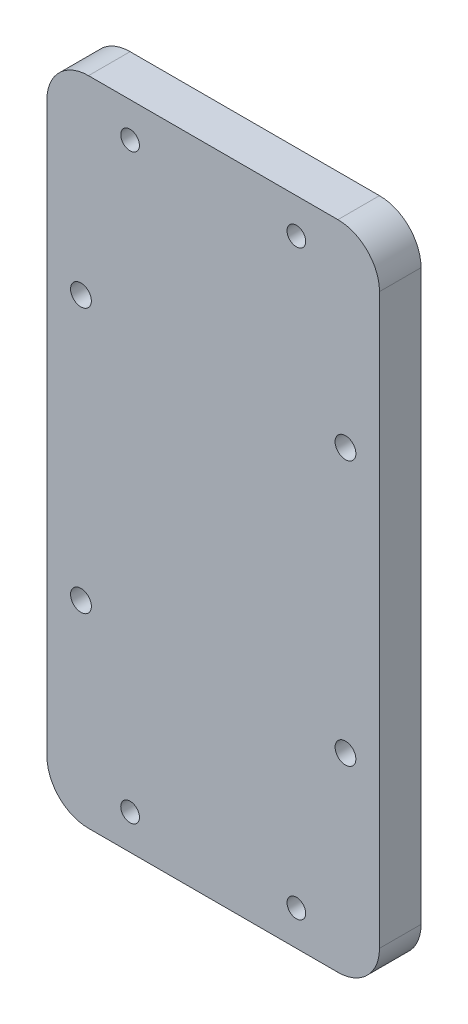
ISO-10303-21;
HEADER;
FILE_DESCRIPTION(('STEP AP214'),'2;1');
FILE_NAME('part.step','',(''),(''),'','','');
FILE_SCHEMA(('AUTOMOTIVE_DESIGN { 1 0 10303 214 1 1 1 1 }'));
ENDSEC;
DATA;
#1=APPLICATION_CONTEXT('core data for automotive mechanical design processes');
#2=APPLICATION_PROTOCOL_DEFINITION('international standard','automotive_design',2000,#1);
#3=PRODUCT_CONTEXT('',#1,'mechanical');
#4=PRODUCT('Part','Part','',(#3));
#5=PRODUCT_RELATED_PRODUCT_CATEGORY('part','',(#4));
#6=PRODUCT_DEFINITION_FORMATION('','',#4);
#7=PRODUCT_DEFINITION_CONTEXT('part definition',#1,'design');
#8=PRODUCT_DEFINITION('design','',#6,#7);
#9=PRODUCT_DEFINITION_SHAPE('','',#8);
#10=(LENGTH_UNIT() NAMED_UNIT(*) SI_UNIT(.MILLI.,.METRE.));
#11=(NAMED_UNIT(*) PLANE_ANGLE_UNIT() SI_UNIT($,.RADIAN.));
#12=(NAMED_UNIT(*) SI_UNIT($,.STERADIAN.) SOLID_ANGLE_UNIT());
#13=UNCERTAINTY_MEASURE_WITH_UNIT(LENGTH_MEASURE(1.E-05),#10,'distance_accuracy_value','');
#14=(GEOMETRIC_REPRESENTATION_CONTEXT(3) GLOBAL_UNCERTAINTY_ASSIGNED_CONTEXT((#13)) GLOBAL_UNIT_ASSIGNED_CONTEXT((#10,
#11,#12)) REPRESENTATION_CONTEXT('',''));
#15=CARTESIAN_POINT('',(0.,0.,0.));
#16=DIRECTION('',(0.,0.,1.));
#17=DIRECTION('',(1.,0.,0.));
#18=AXIS2_PLACEMENT_3D('',#15,#16,#17);
#19=CARTESIAN_POINT('',(30.,68.4127881051919,10.));
#20=DIRECTION('',(0.,0.,1.));
#21=DIRECTION('',(1.,0.,0.));
#22=AXIS2_PLACEMENT_3D('',#19,#20,#21);
#23=PLANE('',#22);
#24=CARTESIAN_POINT('',(31.8198051533946,31.8198051533947,10.));
#25=DIRECTION('',(0.,0.,1.));
#26=DIRECTION('',(1.,0.,0.));
#27=AXIS2_PLACEMENT_3D('',#24,#25,#26);
#28=CIRCLE('',#27,2.49999999999999);
#29=CARTESIAN_POINT('',(34.3198051533946,31.8198051533947,10.));
#30=VERTEX_POINT('',#29);
#31=EDGE_CURVE('E231',#30,#30,#28,.T.);
#32=ORIENTED_EDGE('',*,*,#31,.F.);
#33=EDGE_LOOP('',(#32));
#34=FACE_BOUND('',#33,.T.);
#35=CARTESIAN_POINT('',(-31.8198051533948,31.8198051533945,10.));
#36=DIRECTION('',(0.,0.,1.));
#37=DIRECTION('',(1.,0.,0.));
#38=AXIS2_PLACEMENT_3D('',#35,#36,#37);
#39=CIRCLE('',#38,2.49999999999999);
#40=CARTESIAN_POINT('',(-29.3198051533948,31.8198051533945,10.));
#41=VERTEX_POINT('',#40);
#42=EDGE_CURVE('E226',#41,#41,#39,.T.);
#43=ORIENTED_EDGE('',*,*,#42,.F.);
#44=EDGE_LOOP('',(#43));
#45=FACE_BOUND('',#44,.T.);
#46=CARTESIAN_POINT('',(31.8198051533948,-31.8198051533945,10.));
#47=DIRECTION('',(0.,0.,1.));
#48=DIRECTION('',(1.,0.,0.));
#49=AXIS2_PLACEMENT_3D('',#46,#47,#48);
#50=CIRCLE('',#49,2.49999999999999);
#51=CARTESIAN_POINT('',(34.3198051533948,-31.8198051533945,10.));
#52=VERTEX_POINT('',#51);
#53=EDGE_CURVE('E222',#52,#52,#50,.T.);
#54=ORIENTED_EDGE('',*,*,#53,.F.);
#55=EDGE_LOOP('',(#54));
#56=FACE_BOUND('',#55,.T.);
#57=CARTESIAN_POINT('',(-31.8198051533944,-31.8198051533949,10.));
#58=DIRECTION('',(0.,0.,1.));
#59=DIRECTION('',(1.,0.,0.));
#60=AXIS2_PLACEMENT_3D('',#57,#58,#59);
#61=CIRCLE('',#60,2.49999999999999);
#62=CARTESIAN_POINT('',(-29.3198051533944,-31.8198051533949,10.));
#63=VERTEX_POINT('',#62);
#64=EDGE_CURVE('E214',#63,#63,#61,.T.);
#65=ORIENTED_EDGE('',*,*,#64,.F.);
#66=EDGE_LOOP('',(#65));
#67=FACE_BOUND('',#66,.T.);
#68=CARTESIAN_POINT('',(20.,-70.,10.));
#69=DIRECTION('',(0.,0.,1.));
#70=DIRECTION('',(1.,0.,0.));
#71=AXIS2_PLACEMENT_3D('',#68,#69,#70);
#72=CIRCLE('',#71,2.25);
#73=CARTESIAN_POINT('',(22.25,-70.,10.));
#74=VERTEX_POINT('',#73);
#75=EDGE_CURVE('E196',#74,#74,#72,.T.);
#76=ORIENTED_EDGE('',*,*,#75,.F.);
#77=EDGE_LOOP('',(#76));
#78=FACE_BOUND('',#77,.T.);
#79=CARTESIAN_POINT('',(-20.,70.,10.));
#80=DIRECTION('',(0.,0.,1.));
#81=DIRECTION('',(1.,0.,0.));
#82=AXIS2_PLACEMENT_3D('',#79,#80,#81);
#83=CIRCLE('',#82,2.25);
#84=CARTESIAN_POINT('',(-17.75,70.,10.));
#85=VERTEX_POINT('',#84);
#86=EDGE_CURVE('E145',#85,#85,#83,.T.);
#87=ORIENTED_EDGE('',*,*,#86,.F.);
#88=EDGE_LOOP('',(#87));
#89=FACE_BOUND('',#88,.T.);
#90=CARTESIAN_POINT('',(30.,68.4127881051919,10.));
#91=DIRECTION('',(0.,0.,1.));
#92=DIRECTION('',(1.,0.,0.));
#93=AXIS2_PLACEMENT_3D('',#90,#91,#92);
#94=CIRCLE('',#93,9.99999999999999);
#95=CARTESIAN_POINT('',(40.,68.4127881051919,10.));
#96=VERTEX_POINT('',#95);
#97=CARTESIAN_POINT('',(30.,78.4127881051919,10.));
#98=VERTEX_POINT('',#97);
#99=EDGE_CURVE('E154',#96,#98,#94,.T.);
#100=ORIENTED_EDGE('',*,*,#99,.T.);
#101=DIRECTION('',(-1.,0.,0.));
#102=VECTOR('',#101,1.);
#103=CARTESIAN_POINT('',(-30.,78.4127881051919,10.));
#104=LINE('',#103,#102);
#105=CARTESIAN_POINT('',(-30.,78.4127881051919,10.));
#106=VERTEX_POINT('',#105);
#107=EDGE_CURVE('E103',#98,#106,#104,.T.);
#108=ORIENTED_EDGE('',*,*,#107,.T.);
#109=CARTESIAN_POINT('',(-30.,68.4127881051919,10.));
#110=DIRECTION('',(0.,0.,1.));
#111=DIRECTION('',(1.,0.,0.));
#112=AXIS2_PLACEMENT_3D('',#109,#110,#111);
#113=CIRCLE('',#112,9.99999999999999);
#114=CARTESIAN_POINT('',(-40.,68.4127881051919,10.));
#115=VERTEX_POINT('',#114);
#116=EDGE_CURVE('E168',#106,#115,#113,.T.);
#117=ORIENTED_EDGE('',*,*,#116,.T.);
#118=DIRECTION('',(0.,-1.,0.));
#119=VECTOR('',#118,1.);
#120=CARTESIAN_POINT('',(-40.,68.4127881051919,10.));
#121=LINE('',#120,#119);
#122=CARTESIAN_POINT('',(-40.,-68.4127881051919,10.));
#123=VERTEX_POINT('',#122);
#124=EDGE_CURVE('E181',#115,#123,#121,.T.);
#125=ORIENTED_EDGE('',*,*,#124,.T.);
#126=CARTESIAN_POINT('',(-30.,-68.4127881051919,10.));
#127=DIRECTION('',(0.,0.,1.));
#128=DIRECTION('',(-1.,0.,0.));
#129=AXIS2_PLACEMENT_3D('',#126,#127,#128);
#130=CIRCLE('',#129,10.);
#131=CARTESIAN_POINT('',(-30.,-78.4127881051919,10.));
#132=VERTEX_POINT('',#131);
#133=EDGE_CURVE('E125',#123,#132,#130,.T.);
#134=ORIENTED_EDGE('',*,*,#133,.T.);
#135=DIRECTION('',(1.,0.,0.));
#136=VECTOR('',#135,1.);
#137=CARTESIAN_POINT('',(-30.,-78.4127881051919,10.));
#138=LINE('',#137,#136);
#139=CARTESIAN_POINT('',(30.,-78.4127881051919,10.));
#140=VERTEX_POINT('',#139);
#141=EDGE_CURVE('E119',#132,#140,#138,.T.);
#142=ORIENTED_EDGE('',*,*,#141,.T.);
#143=CARTESIAN_POINT('',(30.,-68.4127881051919,10.));
#144=DIRECTION('',(0.,0.,1.));
#145=DIRECTION('',(1.,0.,0.));
#146=AXIS2_PLACEMENT_3D('',#143,#144,#145);
#147=CIRCLE('',#146,9.99999999999999);
#148=CARTESIAN_POINT('',(40.,-68.4127881051919,10.));
#149=VERTEX_POINT('',#148);
#150=EDGE_CURVE('E117',#140,#149,#147,.T.);
#151=ORIENTED_EDGE('',*,*,#150,.T.);
#152=DIRECTION('',(0.,1.,0.));
#153=VECTOR('',#152,1.);
#154=CARTESIAN_POINT('',(40.,68.4127881051919,10.));
#155=LINE('',#154,#153);
#156=EDGE_CURVE('E58',#149,#96,#155,.T.);
#157=ORIENTED_EDGE('',*,*,#156,.T.);
#158=EDGE_LOOP('',(#100,#108,#117,#125,#134,#142,#151,#157));
#159=FACE_BOUND('',#158,.T.);
#160=CARTESIAN_POINT('',(20.,70.,10.));
#161=DIRECTION('',(0.,0.,1.));
#162=DIRECTION('',(-1.,0.,0.));
#163=AXIS2_PLACEMENT_3D('',#160,#161,#162);
#164=CIRCLE('',#163,2.25);
#165=CARTESIAN_POINT('',(17.75,70.,10.));
#166=VERTEX_POINT('',#165);
#167=EDGE_CURVE('E195',#166,#166,#164,.T.);
#168=ORIENTED_EDGE('',*,*,#167,.F.);
#169=EDGE_LOOP('',(#168));
#170=FACE_BOUND('',#169,.T.);
#171=CARTESIAN_POINT('',(-20.,-70.,10.));
#172=DIRECTION('',(0.,0.,1.));
#173=DIRECTION('',(-1.,0.,0.));
#174=AXIS2_PLACEMENT_3D('',#171,#172,#173);
#175=CIRCLE('',#174,2.25);
#176=CARTESIAN_POINT('',(-22.25,-70.,10.));
#177=VERTEX_POINT('',#176);
#178=EDGE_CURVE('E204',#177,#177,#175,.T.);
#179=ORIENTED_EDGE('',*,*,#178,.F.);
#180=EDGE_LOOP('',(#179));
#181=FACE_BOUND('',#180,.T.);
#182=ADVANCED_FACE('F43',(#34,#45,#56,#67,#78,#89,#159,#170,#181),#23,.T.);
#183=CARTESIAN_POINT('',(30.,68.4127881051919,0.));
#184=DIRECTION('',(0.,0.,1.));
#185=DIRECTION('',(1.,0.,0.));
#186=AXIS2_PLACEMENT_3D('',#183,#184,#185);
#187=PLANE('',#186);
#188=CARTESIAN_POINT('',(31.8198051533946,31.8198051533947,0.));
#189=DIRECTION('',(0.,0.,1.));
#190=DIRECTION('',(1.,0.,0.));
#191=AXIS2_PLACEMENT_3D('',#188,#189,#190);
#192=CIRCLE('',#191,2.5);
#193=CARTESIAN_POINT('',(34.3198051533946,31.8198051533947,0.));
#194=VERTEX_POINT('',#193);
#195=EDGE_CURVE('E227',#194,#194,#192,.T.);
#196=ORIENTED_EDGE('',*,*,#195,.T.);
#197=EDGE_LOOP('',(#196));
#198=FACE_BOUND('',#197,.T.);
#199=CARTESIAN_POINT('',(-31.8198051533948,31.8198051533945,0.));
#200=DIRECTION('',(0.,0.,1.));
#201=DIRECTION('',(1.,0.,0.));
#202=AXIS2_PLACEMENT_3D('',#199,#200,#201);
#203=CIRCLE('',#202,2.5);
#204=CARTESIAN_POINT('',(-29.3198051533948,31.8198051533945,0.));
#205=VERTEX_POINT('',#204);
#206=EDGE_CURVE('E221',#205,#205,#203,.T.);
#207=ORIENTED_EDGE('',*,*,#206,.T.);
#208=EDGE_LOOP('',(#207));
#209=FACE_BOUND('',#208,.T.);
#210=CARTESIAN_POINT('',(31.8198051533948,-31.8198051533945,0.));
#211=DIRECTION('',(0.,0.,1.));
#212=DIRECTION('',(1.,0.,0.));
#213=AXIS2_PLACEMENT_3D('',#210,#211,#212);
#214=CIRCLE('',#213,2.5);
#215=CARTESIAN_POINT('',(34.3198051533948,-31.8198051533945,0.));
#216=VERTEX_POINT('',#215);
#217=EDGE_CURVE('E217',#216,#216,#214,.T.);
#218=ORIENTED_EDGE('',*,*,#217,.T.);
#219=EDGE_LOOP('',(#218));
#220=FACE_BOUND('',#219,.T.);
#221=CARTESIAN_POINT('',(-31.8198051533944,-31.8198051533949,0.));
#222=DIRECTION('',(0.,0.,1.));
#223=DIRECTION('',(1.,0.,0.));
#224=AXIS2_PLACEMENT_3D('',#221,#222,#223);
#225=CIRCLE('',#224,2.5);
#226=CARTESIAN_POINT('',(-29.3198051533944,-31.8198051533949,0.));
#227=VERTEX_POINT('',#226);
#228=EDGE_CURVE('E209',#227,#227,#225,.T.);
#229=ORIENTED_EDGE('',*,*,#228,.T.);
#230=EDGE_LOOP('',(#229));
#231=FACE_BOUND('',#230,.T.);
#232=CARTESIAN_POINT('',(30.,68.4127881051919,0.));
#233=DIRECTION('',(0.,0.,1.));
#234=DIRECTION('',(1.,0.,0.));
#235=AXIS2_PLACEMENT_3D('',#232,#233,#234);
#236=CIRCLE('',#235,9.99999999999999);
#237=CARTESIAN_POINT('',(40.,68.4127881051919,0.));
#238=VERTEX_POINT('',#237);
#239=CARTESIAN_POINT('',(30.,78.4127881051919,0.));
#240=VERTEX_POINT('',#239);
#241=EDGE_CURVE('E139',#238,#240,#236,.T.);
#242=ORIENTED_EDGE('',*,*,#241,.F.);
#243=DIRECTION('',(0.,1.,0.));
#244=VECTOR('',#243,1.);
#245=CARTESIAN_POINT('',(40.,68.4127881051919,0.));
#246=LINE('',#245,#244);
#247=CARTESIAN_POINT('',(40.,-68.4127881051919,0.));
#248=VERTEX_POINT('',#247);
#249=EDGE_CURVE('E92',#248,#238,#246,.T.);
#250=ORIENTED_EDGE('',*,*,#249,.F.);
#251=CARTESIAN_POINT('',(30.,-68.4127881051919,0.));
#252=DIRECTION('',(0.,0.,1.));
#253=DIRECTION('',(1.,0.,0.));
#254=AXIS2_PLACEMENT_3D('',#251,#252,#253);
#255=CIRCLE('',#254,9.99999999999999);
#256=CARTESIAN_POINT('',(30.,-78.4127881051919,0.));
#257=VERTEX_POINT('',#256);
#258=EDGE_CURVE('E90',#257,#248,#255,.T.);
#259=ORIENTED_EDGE('',*,*,#258,.F.);
#260=DIRECTION('',(1.,0.,0.));
#261=VECTOR('',#260,1.);
#262=CARTESIAN_POINT('',(-30.,-78.4127881051919,0.));
#263=LINE('',#262,#261);
#264=CARTESIAN_POINT('',(-30.,-78.4127881051919,0.));
#265=VERTEX_POINT('',#264);
#266=EDGE_CURVE('E128',#265,#257,#263,.T.);
#267=ORIENTED_EDGE('',*,*,#266,.F.);
#268=CARTESIAN_POINT('',(-30.,-68.4127881051919,0.));
#269=DIRECTION('',(0.,0.,1.));
#270=DIRECTION('',(-1.,0.,0.));
#271=AXIS2_PLACEMENT_3D('',#268,#269,#270);
#272=CIRCLE('',#271,10.);
#273=CARTESIAN_POINT('',(-40.,-68.4127881051919,0.));
#274=VERTEX_POINT('',#273);
#275=EDGE_CURVE('E147',#274,#265,#272,.T.);
#276=ORIENTED_EDGE('',*,*,#275,.F.);
#277=DIRECTION('',(0.,-1.,0.));
#278=VECTOR('',#277,1.);
#279=CARTESIAN_POINT('',(-40.,68.4127881051919,0.));
#280=LINE('',#279,#278);
#281=CARTESIAN_POINT('',(-40.,68.4127881051919,0.));
#282=VERTEX_POINT('',#281);
#283=EDGE_CURVE('E146',#282,#274,#280,.T.);
#284=ORIENTED_EDGE('',*,*,#283,.F.);
#285=CARTESIAN_POINT('',(-30.,68.4127881051919,0.));
#286=DIRECTION('',(0.,0.,1.));
#287=DIRECTION('',(1.,0.,0.));
#288=AXIS2_PLACEMENT_3D('',#285,#286,#287);
#289=CIRCLE('',#288,9.99999999999999);
#290=CARTESIAN_POINT('',(-30.,78.4127881051919,0.));
#291=VERTEX_POINT('',#290);
#292=EDGE_CURVE('E148',#291,#282,#289,.T.);
#293=ORIENTED_EDGE('',*,*,#292,.F.);
#294=DIRECTION('',(-1.,0.,0.));
#295=VECTOR('',#294,1.);
#296=CARTESIAN_POINT('',(-30.,78.4127881051919,0.));
#297=LINE('',#296,#295);
#298=EDGE_CURVE('E141',#240,#291,#297,.T.);
#299=ORIENTED_EDGE('',*,*,#298,.F.);
#300=EDGE_LOOP('',(#242,#250,#259,#267,#276,#284,#293,#299));
#301=FACE_BOUND('',#300,.T.);
#302=CARTESIAN_POINT('',(-20.,70.,0.));
#303=DIRECTION('',(0.,0.,1.));
#304=DIRECTION('',(1.,0.,0.));
#305=AXIS2_PLACEMENT_3D('',#302,#303,#304);
#306=CIRCLE('',#305,2.25);
#307=CARTESIAN_POINT('',(-17.75,70.,0.));
#308=VERTEX_POINT('',#307);
#309=EDGE_CURVE('E188',#308,#308,#306,.T.);
#310=ORIENTED_EDGE('',*,*,#309,.T.);
#311=EDGE_LOOP('',(#310));
#312=FACE_BOUND('',#311,.T.);
#313=CARTESIAN_POINT('',(20.,70.,0.));
#314=DIRECTION('',(0.,0.,1.));
#315=DIRECTION('',(-1.,0.,0.));
#316=AXIS2_PLACEMENT_3D('',#313,#314,#315);
#317=CIRCLE('',#316,2.25);
#318=CARTESIAN_POINT('',(17.75,70.,0.));
#319=VERTEX_POINT('',#318);
#320=EDGE_CURVE('E194',#319,#319,#317,.T.);
#321=ORIENTED_EDGE('',*,*,#320,.T.);
#322=EDGE_LOOP('',(#321));
#323=FACE_BOUND('',#322,.T.);
#324=CARTESIAN_POINT('',(20.,-70.,0.));
#325=DIRECTION('',(0.,0.,1.));
#326=DIRECTION('',(1.,0.,0.));
#327=AXIS2_PLACEMENT_3D('',#324,#325,#326);
#328=CIRCLE('',#327,2.25);
#329=CARTESIAN_POINT('',(22.25,-70.,0.));
#330=VERTEX_POINT('',#329);
#331=EDGE_CURVE('E203',#330,#330,#328,.T.);
#332=ORIENTED_EDGE('',*,*,#331,.T.);
#333=EDGE_LOOP('',(#332));
#334=FACE_BOUND('',#333,.T.);
#335=CARTESIAN_POINT('',(-20.,-70.,0.));
#336=DIRECTION('',(0.,0.,1.));
#337=DIRECTION('',(-1.,0.,0.));
#338=AXIS2_PLACEMENT_3D('',#335,#336,#337);
#339=CIRCLE('',#338,2.25);
#340=CARTESIAN_POINT('',(-22.25,-70.,0.));
#341=VERTEX_POINT('',#340);
#342=EDGE_CURVE('E210',#341,#341,#339,.T.);
#343=ORIENTED_EDGE('',*,*,#342,.T.);
#344=EDGE_LOOP('',(#343));
#345=FACE_BOUND('',#344,.T.);
#346=ADVANCED_FACE('F173',(#198,#209,#220,#231,#301,#312,#323,#334,#345),#187,.F.);
#347=CARTESIAN_POINT('',(30.,68.4127881051919,10.));
#348=DIRECTION('',(0.,0.,-1.));
#349=DIRECTION('',(-1.,0.,0.));
#350=AXIS2_PLACEMENT_3D('',#347,#348,#349);
#351=CYLINDRICAL_SURFACE('',#350,9.99999999999999);
#352=ORIENTED_EDGE('',*,*,#241,.T.);
#353=DIRECTION('',(0.,0.,-1.));
#354=VECTOR('',#353,1.);
#355=CARTESIAN_POINT('',(30.,78.4127881051919,10.));
#356=LINE('',#355,#354);
#357=EDGE_CURVE('E11',#98,#240,#356,.T.);
#358=ORIENTED_EDGE('',*,*,#357,.F.);
#359=ORIENTED_EDGE('',*,*,#99,.F.);
#360=DIRECTION('',(0.,0.,-1.));
#361=VECTOR('',#360,1.);
#362=CARTESIAN_POINT('',(40.,68.4127881051919,10.));
#363=LINE('',#362,#361);
#364=EDGE_CURVE('E138',#96,#238,#363,.T.);
#365=ORIENTED_EDGE('',*,*,#364,.T.);
#366=EDGE_LOOP('',(#352,#358,#359,#365));
#367=FACE_BOUND('',#366,.T.);
#368=ADVANCED_FACE('F44',(#367),#351,.T.);
#369=CARTESIAN_POINT('',(-30.,78.4127881051919,10.));
#370=DIRECTION('',(0.,-1.,0.));
#371=DIRECTION('',(0.,0.,-1.));
#372=AXIS2_PLACEMENT_3D('',#369,#370,#371);
#373=PLANE('',#372);
#374=ORIENTED_EDGE('',*,*,#298,.T.);
#375=DIRECTION('',(0.,0.,-1.));
#376=VECTOR('',#375,1.);
#377=CARTESIAN_POINT('',(-30.,78.4127881051919,10.));
#378=LINE('',#377,#376);
#379=EDGE_CURVE('E55',#106,#291,#378,.T.);
#380=ORIENTED_EDGE('',*,*,#379,.F.);
#381=ORIENTED_EDGE('',*,*,#107,.F.);
#382=ORIENTED_EDGE('',*,*,#357,.T.);
#383=EDGE_LOOP('',(#374,#380,#381,#382));
#384=FACE_BOUND('',#383,.T.);
#385=ADVANCED_FACE('F303',(#384),#373,.F.);
#386=CARTESIAN_POINT('',(-30.,68.4127881051919,10.));
#387=DIRECTION('',(0.,0.,-1.));
#388=DIRECTION('',(-1.,0.,0.));
#389=AXIS2_PLACEMENT_3D('',#386,#387,#388);
#390=CYLINDRICAL_SURFACE('',#389,9.99999999999999);
#391=ORIENTED_EDGE('',*,*,#292,.T.);
#392=DIRECTION('',(0.,0.,-1.));
#393=VECTOR('',#392,1.);
#394=CARTESIAN_POINT('',(-40.,68.4127881051919,10.));
#395=LINE('',#394,#393);
#396=EDGE_CURVE('E165',#115,#282,#395,.T.);
#397=ORIENTED_EDGE('',*,*,#396,.F.);
#398=ORIENTED_EDGE('',*,*,#116,.F.);
#399=ORIENTED_EDGE('',*,*,#379,.T.);
#400=EDGE_LOOP('',(#391,#397,#398,#399));
#401=FACE_BOUND('',#400,.T.);
#402=ADVANCED_FACE('F169',(#401),#390,.T.);
#403=CARTESIAN_POINT('',(-40.,68.4127881051919,10.));
#404=DIRECTION('',(1.,0.,0.));
#405=DIRECTION('',(0.,1.,0.));
#406=AXIS2_PLACEMENT_3D('',#403,#404,#405);
#407=PLANE('',#406);
#408=ORIENTED_EDGE('',*,*,#283,.T.);
#409=DIRECTION('',(0.,0.,-1.));
#410=VECTOR('',#409,1.);
#411=CARTESIAN_POINT('',(-40.,-68.4127881051919,10.));
#412=LINE('',#411,#410);
#413=EDGE_CURVE('E157',#123,#274,#412,.T.);
#414=ORIENTED_EDGE('',*,*,#413,.F.);
#415=ORIENTED_EDGE('',*,*,#124,.F.);
#416=ORIENTED_EDGE('',*,*,#396,.T.);
#417=EDGE_LOOP('',(#408,#414,#415,#416));
#418=FACE_BOUND('',#417,.T.);
#419=ADVANCED_FACE('F177',(#418),#407,.F.);
#420=CARTESIAN_POINT('',(-30.,-68.4127881051919,10.));
#421=DIRECTION('',(0.,0.,-1.));
#422=DIRECTION('',(-1.,0.,0.));
#423=AXIS2_PLACEMENT_3D('',#420,#421,#422);
#424=CYLINDRICAL_SURFACE('',#423,10.);
#425=ORIENTED_EDGE('',*,*,#275,.T.);
#426=DIRECTION('',(0.,0.,-1.));
#427=VECTOR('',#426,1.);
#428=CARTESIAN_POINT('',(-30.,-78.4127881051919,10.));
#429=LINE('',#428,#427);
#430=EDGE_CURVE('E134',#132,#265,#429,.T.);
#431=ORIENTED_EDGE('',*,*,#430,.F.);
#432=ORIENTED_EDGE('',*,*,#133,.F.);
#433=ORIENTED_EDGE('',*,*,#413,.T.);
#434=EDGE_LOOP('',(#425,#431,#432,#433));
#435=FACE_BOUND('',#434,.T.);
#436=ADVANCED_FACE('F185',(#435),#424,.T.);
#437=CARTESIAN_POINT('',(-30.,-78.4127881051919,10.));
#438=DIRECTION('',(0.,1.,0.));
#439=DIRECTION('',(-1.,0.,0.));
#440=AXIS2_PLACEMENT_3D('',#437,#438,#439);
#441=PLANE('',#440);
#442=ORIENTED_EDGE('',*,*,#266,.T.);
#443=DIRECTION('',(0.,0.,-1.));
#444=VECTOR('',#443,1.);
#445=CARTESIAN_POINT('',(30.,-78.4127881051919,10.));
#446=LINE('',#445,#444);
#447=EDGE_CURVE('E130',#140,#257,#446,.T.);
#448=ORIENTED_EDGE('',*,*,#447,.F.);
#449=ORIENTED_EDGE('',*,*,#141,.F.);
#450=ORIENTED_EDGE('',*,*,#430,.T.);
#451=EDGE_LOOP('',(#442,#448,#449,#450));
#452=FACE_BOUND('',#451,.T.);
#453=ADVANCED_FACE('F126',(#452),#441,.F.);
#454=CARTESIAN_POINT('',(30.,-68.4127881051919,10.));
#455=DIRECTION('',(0.,0.,-1.));
#456=DIRECTION('',(-1.,0.,0.));
#457=AXIS2_PLACEMENT_3D('',#454,#455,#456);
#458=CYLINDRICAL_SURFACE('',#457,9.99999999999999);
#459=ORIENTED_EDGE('',*,*,#258,.T.);
#460=DIRECTION('',(0.,0.,-1.));
#461=VECTOR('',#460,1.);
#462=CARTESIAN_POINT('',(40.,-68.4127881051919,10.));
#463=LINE('',#462,#461);
#464=EDGE_CURVE('E131',#149,#248,#463,.T.);
#465=ORIENTED_EDGE('',*,*,#464,.F.);
#466=ORIENTED_EDGE('',*,*,#150,.F.);
#467=ORIENTED_EDGE('',*,*,#447,.T.);
#468=EDGE_LOOP('',(#459,#465,#466,#467));
#469=FACE_BOUND('',#468,.T.);
#470=ADVANCED_FACE('F133',(#469),#458,.T.);
#471=CARTESIAN_POINT('',(40.,68.4127881051919,10.));
#472=DIRECTION('',(-1.,0.,0.));
#473=DIRECTION('',(0.,-1.,0.));
#474=AXIS2_PLACEMENT_3D('',#471,#472,#473);
#475=PLANE('',#474);
#476=ORIENTED_EDGE('',*,*,#249,.T.);
#477=ORIENTED_EDGE('',*,*,#364,.F.);
#478=ORIENTED_EDGE('',*,*,#156,.F.);
#479=ORIENTED_EDGE('',*,*,#464,.T.);
#480=EDGE_LOOP('',(#476,#477,#478,#479));
#481=FACE_BOUND('',#480,.T.);
#482=ADVANCED_FACE('F258',(#481),#475,.F.);
#483=CARTESIAN_POINT('',(-20.,70.,10.));
#484=DIRECTION('',(0.,0.,-1.));
#485=DIRECTION('',(-1.,0.,0.));
#486=AXIS2_PLACEMENT_3D('',#483,#484,#485);
#487=CYLINDRICAL_SURFACE('',#486,2.25);
#488=ORIENTED_EDGE('',*,*,#86,.T.);
#489=EDGE_LOOP('',(#488));
#490=FACE_BOUND('',#489,.T.);
#491=ORIENTED_EDGE('',*,*,#309,.F.);
#492=EDGE_LOOP('',(#491));
#493=FACE_BOUND('',#492,.T.);
#494=ADVANCED_FACE('F252',(#490,#493),#487,.F.);
#495=CARTESIAN_POINT('',(20.,70.,10.));
#496=DIRECTION('',(0.,0.,-1.));
#497=DIRECTION('',(-1.,0.,0.));
#498=AXIS2_PLACEMENT_3D('',#495,#496,#497);
#499=CYLINDRICAL_SURFACE('',#498,2.25);
#500=ORIENTED_EDGE('',*,*,#167,.T.);
#501=EDGE_LOOP('',(#500));
#502=FACE_BOUND('',#501,.T.);
#503=ORIENTED_EDGE('',*,*,#320,.F.);
#504=EDGE_LOOP('',(#503));
#505=FACE_BOUND('',#504,.T.);
#506=ADVANCED_FACE('F254',(#502,#505),#499,.F.);
#507=CARTESIAN_POINT('',(20.,-70.,10.));
#508=DIRECTION('',(0.,0.,-1.));
#509=DIRECTION('',(-1.,0.,0.));
#510=AXIS2_PLACEMENT_3D('',#507,#508,#509);
#511=CYLINDRICAL_SURFACE('',#510,2.25);
#512=ORIENTED_EDGE('',*,*,#75,.T.);
#513=EDGE_LOOP('',(#512));
#514=FACE_BOUND('',#513,.T.);
#515=ORIENTED_EDGE('',*,*,#331,.F.);
#516=EDGE_LOOP('',(#515));
#517=FACE_BOUND('',#516,.T.);
#518=ADVANCED_FACE('F275',(#514,#517),#511,.F.);
#519=CARTESIAN_POINT('',(-20.,-70.,10.));
#520=DIRECTION('',(0.,0.,-1.));
#521=DIRECTION('',(-1.,0.,0.));
#522=AXIS2_PLACEMENT_3D('',#519,#520,#521);
#523=CYLINDRICAL_SURFACE('',#522,2.25);
#524=ORIENTED_EDGE('',*,*,#178,.T.);
#525=EDGE_LOOP('',(#524));
#526=FACE_BOUND('',#525,.T.);
#527=ORIENTED_EDGE('',*,*,#342,.F.);
#528=EDGE_LOOP('',(#527));
#529=FACE_BOUND('',#528,.T.);
#530=ADVANCED_FACE('F267',(#526,#529),#523,.F.);
#531=CARTESIAN_POINT('',(-31.8198051533944,-31.8198051533949,10.));
#532=DIRECTION('',(0.,0.,1.));
#533=DIRECTION('',(1.,0.,0.));
#534=AXIS2_PLACEMENT_3D('',#531,#532,#533);
#535=CYLINDRICAL_SURFACE('',#534,2.49999999999999);
#536=ORIENTED_EDGE('',*,*,#228,.F.);
#537=EDGE_LOOP('',(#536));
#538=FACE_BOUND('',#537,.T.);
#539=ORIENTED_EDGE('',*,*,#64,.T.);
#540=EDGE_LOOP('',(#539));
#541=FACE_BOUND('',#540,.T.);
#542=ADVANCED_FACE('F271',(#538,#541),#535,.F.);
#543=CARTESIAN_POINT('',(31.8198051533948,-31.8198051533945,10.));
#544=DIRECTION('',(0.,0.,1.));
#545=DIRECTION('',(1.,0.,0.));
#546=AXIS2_PLACEMENT_3D('',#543,#544,#545);
#547=CYLINDRICAL_SURFACE('',#546,2.49999999999999);
#548=ORIENTED_EDGE('',*,*,#217,.F.);
#549=EDGE_LOOP('',(#548));
#550=FACE_BOUND('',#549,.T.);
#551=ORIENTED_EDGE('',*,*,#53,.T.);
#552=EDGE_LOOP('',(#551));
#553=FACE_BOUND('',#552,.T.);
#554=ADVANCED_FACE('F278',(#550,#553),#547,.F.);
#555=CARTESIAN_POINT('',(-31.8198051533948,31.8198051533945,10.));
#556=DIRECTION('',(0.,0.,1.));
#557=DIRECTION('',(1.,0.,0.));
#558=AXIS2_PLACEMENT_3D('',#555,#556,#557);
#559=CYLINDRICAL_SURFACE('',#558,2.49999999999999);
#560=ORIENTED_EDGE('',*,*,#206,.F.);
#561=EDGE_LOOP('',(#560));
#562=FACE_BOUND('',#561,.T.);
#563=ORIENTED_EDGE('',*,*,#42,.T.);
#564=EDGE_LOOP('',(#563));
#565=FACE_BOUND('',#564,.T.);
#566=ADVANCED_FACE('F400',(#562,#565),#559,.F.);
#567=CARTESIAN_POINT('',(31.8198051533946,31.8198051533947,10.));
#568=DIRECTION('',(0.,0.,1.));
#569=DIRECTION('',(1.,0.,0.));
#570=AXIS2_PLACEMENT_3D('',#567,#568,#569);
#571=CYLINDRICAL_SURFACE('',#570,2.5);
#572=ORIENTED_EDGE('',*,*,#195,.F.);
#573=EDGE_LOOP('',(#572));
#574=FACE_BOUND('',#573,.T.);
#575=ORIENTED_EDGE('',*,*,#31,.T.);
#576=EDGE_LOOP('',(#575));
#577=FACE_BOUND('',#576,.T.);
#578=ADVANCED_FACE('F240',(#574,#577),#571,.F.);
#579=CLOSED_SHELL('',(#182,#346,#368,#385,#402,#419,#436,#453,#470,#482,#494,#506,#518,#530,
#542,#554,#566,#578));
#580=MANIFOLD_SOLID_BREP('B2',#579);
#581=ADVANCED_BREP_SHAPE_REPRESENTATION('',(#18,#580),#14);
#582=SHAPE_DEFINITION_REPRESENTATION(#9,#581);
ENDSEC;
END-ISO-10303-21;
